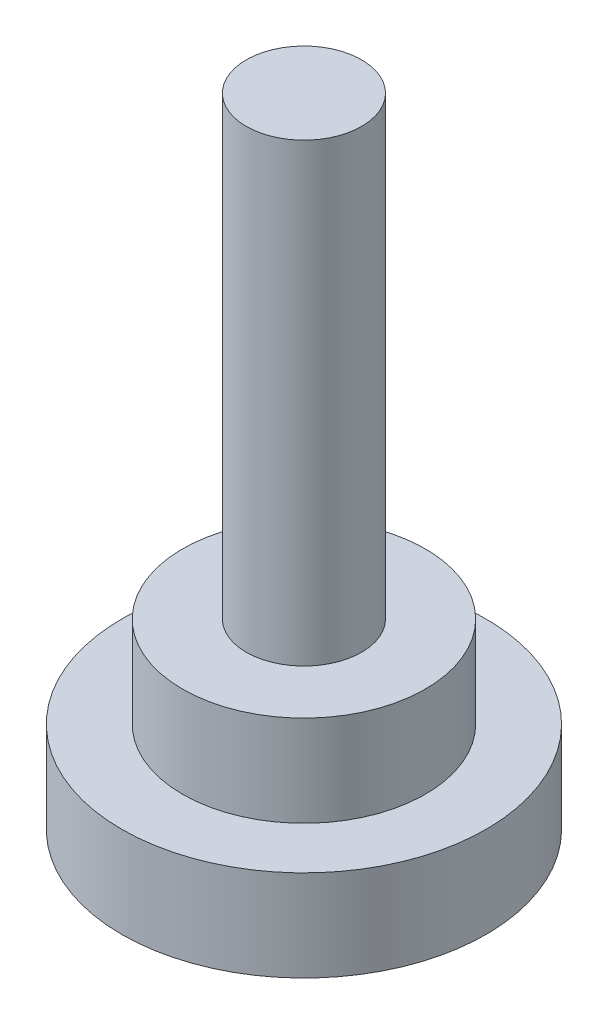
ISO-10303-21;
HEADER;
FILE_DESCRIPTION(('STEP AP214'),'2;1');
FILE_NAME('part.step','',(''),(''),'','','');
FILE_SCHEMA(('AUTOMOTIVE_DESIGN { 1 0 10303 214 1 1 1 1 }'));
ENDSEC;
DATA;
#1=APPLICATION_CONTEXT('core data for automotive mechanical design processes');
#2=APPLICATION_PROTOCOL_DEFINITION('international standard','automotive_design',2000,#1);
#3=PRODUCT_CONTEXT('',#1,'mechanical');
#4=PRODUCT('Part','Part','',(#3));
#5=PRODUCT_RELATED_PRODUCT_CATEGORY('part','',(#4));
#6=PRODUCT_DEFINITION_FORMATION('','',#4);
#7=PRODUCT_DEFINITION_CONTEXT('part definition',#1,'design');
#8=PRODUCT_DEFINITION('design','',#6,#7);
#9=PRODUCT_DEFINITION_SHAPE('','',#8);
#10=(LENGTH_UNIT() NAMED_UNIT(*) SI_UNIT(.MILLI.,.METRE.));
#11=(NAMED_UNIT(*) PLANE_ANGLE_UNIT() SI_UNIT($,.RADIAN.));
#12=(NAMED_UNIT(*) SI_UNIT($,.STERADIAN.) SOLID_ANGLE_UNIT());
#13=UNCERTAINTY_MEASURE_WITH_UNIT(LENGTH_MEASURE(1.E-05),#10,'distance_accuracy_value','');
#14=(GEOMETRIC_REPRESENTATION_CONTEXT(3) GLOBAL_UNCERTAINTY_ASSIGNED_CONTEXT((#13)) GLOBAL_UNIT_ASSIGNED_CONTEXT((#10,
#11,#12)) REPRESENTATION_CONTEXT('',''));
#15=CARTESIAN_POINT('',(0.,0.,0.));
#16=DIRECTION('',(0.,0.,1.));
#17=DIRECTION('',(1.,0.,0.));
#18=AXIS2_PLACEMENT_3D('',#15,#16,#17);
#19=CARTESIAN_POINT('',(0.,3.,0.));
#20=DIRECTION('',(0.,-1.,0.));
#21=DIRECTION('',(0.,0.,-1.));
#22=AXIS2_PLACEMENT_3D('',#19,#20,#21);
#23=CYLINDRICAL_SURFACE('',#22,6.);
#24=CARTESIAN_POINT('',(0.,3.,0.));
#25=DIRECTION('',(0.,1.,0.));
#26=DIRECTION('',(0.,0.,1.));
#27=AXIS2_PLACEMENT_3D('',#24,#25,#26);
#28=CIRCLE('',#27,6.);
#29=CARTESIAN_POINT('',(0.,3.,6.));
#30=VERTEX_POINT('',#29);
#31=EDGE_CURVE('E10',#30,#30,#28,.T.);
#32=ORIENTED_EDGE('',*,*,#31,.F.);
#33=EDGE_LOOP('',(#32));
#34=FACE_BOUND('',#33,.T.);
#35=CARTESIAN_POINT('',(0.,0.,0.));
#36=DIRECTION('',(0.,1.,0.));
#37=DIRECTION('',(0.,0.,1.));
#38=AXIS2_PLACEMENT_3D('',#35,#36,#37);
#39=CIRCLE('',#38,6.);
#40=CARTESIAN_POINT('',(0.,0.,6.));
#41=VERTEX_POINT('',#40);
#42=EDGE_CURVE('E40',#41,#41,#39,.T.);
#43=ORIENTED_EDGE('',*,*,#42,.T.);
#44=EDGE_LOOP('',(#43));
#45=FACE_BOUND('',#44,.T.);
#46=ADVANCED_FACE('F33',(#34,#45),#23,.T.);
#47=CARTESIAN_POINT('',(0.,3.,0.));
#48=DIRECTION('',(0.,1.,0.));
#49=DIRECTION('',(0.,0.,1.));
#50=AXIS2_PLACEMENT_3D('',#47,#48,#49);
#51=PLANE('',#50);
#52=CARTESIAN_POINT('',(0.,3.,0.));
#53=DIRECTION('',(0.,1.,0.));
#54=DIRECTION('',(0.,0.,1.));
#55=AXIS2_PLACEMENT_3D('',#52,#53,#54);
#56=CIRCLE('',#55,4.);
#57=CARTESIAN_POINT('',(0.,3.,4.));
#58=VERTEX_POINT('',#57);
#59=EDGE_CURVE('E49',#58,#58,#56,.T.);
#60=ORIENTED_EDGE('',*,*,#59,.F.);
#61=EDGE_LOOP('',(#60));
#62=FACE_BOUND('',#61,.T.);
#63=ORIENTED_EDGE('',*,*,#31,.T.);
#64=EDGE_LOOP('',(#63));
#65=FACE_BOUND('',#64,.T.);
#66=ADVANCED_FACE('F77',(#62,#65),#51,.T.);
#67=CARTESIAN_POINT('',(0.,0.,0.));
#68=DIRECTION('',(0.,1.,0.));
#69=DIRECTION('',(0.,0.,1.));
#70=AXIS2_PLACEMENT_3D('',#67,#68,#69);
#71=PLANE('',#70);
#72=ORIENTED_EDGE('',*,*,#42,.F.);
#73=EDGE_LOOP('',(#72));
#74=FACE_BOUND('',#73,.T.);
#75=ADVANCED_FACE('F73',(#74),#71,.F.);
#76=CARTESIAN_POINT('',(0.,6.,0.));
#77=DIRECTION('',(0.,-1.,0.));
#78=DIRECTION('',(0.,0.,-1.));
#79=AXIS2_PLACEMENT_3D('',#76,#77,#78);
#80=CYLINDRICAL_SURFACE('',#79,4.);
#81=CARTESIAN_POINT('',(0.,6.,0.));
#82=DIRECTION('',(0.,1.,0.));
#83=DIRECTION('',(0.,0.,1.));
#84=AXIS2_PLACEMENT_3D('',#81,#82,#83);
#85=CIRCLE('',#84,4.);
#86=CARTESIAN_POINT('',(0.,6.,4.));
#87=VERTEX_POINT('',#86);
#88=EDGE_CURVE('E52',#87,#87,#85,.T.);
#89=ORIENTED_EDGE('',*,*,#88,.F.);
#90=EDGE_LOOP('',(#89));
#91=FACE_BOUND('',#90,.T.);
#92=ORIENTED_EDGE('',*,*,#59,.T.);
#93=EDGE_LOOP('',(#92));
#94=FACE_BOUND('',#93,.T.);
#95=ADVANCED_FACE('F65',(#91,#94),#80,.T.);
#96=CARTESIAN_POINT('',(0.,6.,0.));
#97=DIRECTION('',(0.,1.,0.));
#98=DIRECTION('',(0.,0.,1.));
#99=AXIS2_PLACEMENT_3D('',#96,#97,#98);
#100=PLANE('',#99);
#101=CARTESIAN_POINT('',(0.,6.,0.));
#102=DIRECTION('',(0.,1.,0.));
#103=DIRECTION('',(0.,0.,1.));
#104=AXIS2_PLACEMENT_3D('',#101,#102,#103);
#105=CIRCLE('',#104,1.9);
#106=CARTESIAN_POINT('',(0.,6.,1.9));
#107=VERTEX_POINT('',#106);
#108=EDGE_CURVE('E36',#107,#107,#105,.T.);
#109=ORIENTED_EDGE('',*,*,#108,.F.);
#110=EDGE_LOOP('',(#109));
#111=FACE_BOUND('',#110,.T.);
#112=ORIENTED_EDGE('',*,*,#88,.T.);
#113=EDGE_LOOP('',(#112));
#114=FACE_BOUND('',#113,.T.);
#115=ADVANCED_FACE('F62',(#111,#114),#100,.T.);
#116=CARTESIAN_POINT('',(0.,21.,0.));
#117=DIRECTION('',(0.,1.,0.));
#118=DIRECTION('',(0.,0.,1.));
#119=AXIS2_PLACEMENT_3D('',#116,#117,#118);
#120=PLANE('',#119);
#121=CARTESIAN_POINT('',(0.,21.,0.));
#122=DIRECTION('',(0.,1.,0.));
#123=DIRECTION('',(0.,0.,1.));
#124=AXIS2_PLACEMENT_3D('',#121,#122,#123);
#125=CIRCLE('',#124,1.9);
#126=CARTESIAN_POINT('',(0.,21.,1.9));
#127=VERTEX_POINT('',#126);
#128=EDGE_CURVE('E45',#127,#127,#125,.T.);
#129=ORIENTED_EDGE('',*,*,#128,.T.);
#130=EDGE_LOOP('',(#129));
#131=FACE_BOUND('',#130,.T.);
#132=ADVANCED_FACE('F64',(#131),#120,.T.);
#133=CARTESIAN_POINT('',(0.,21.,0.));
#134=DIRECTION('',(0.,-1.,0.));
#135=DIRECTION('',(0.,0.,-1.));
#136=AXIS2_PLACEMENT_3D('',#133,#134,#135);
#137=CYLINDRICAL_SURFACE('',#136,1.9);
#138=ORIENTED_EDGE('',*,*,#108,.T.);
#139=EDGE_LOOP('',(#138));
#140=FACE_BOUND('',#139,.T.);
#141=ORIENTED_EDGE('',*,*,#128,.F.);
#142=EDGE_LOOP('',(#141));
#143=FACE_BOUND('',#142,.T.);
#144=ADVANCED_FACE('F59',(#140,#143),#137,.T.);
#145=CLOSED_SHELL('',(#46,#66,#75,#95,#115,#132,#144));
#146=MANIFOLD_SOLID_BREP('B2',#145);
#147=ADVANCED_BREP_SHAPE_REPRESENTATION('',(#18,#146),#14);
#148=SHAPE_DEFINITION_REPRESENTATION(#9,#147);
ENDSEC;
END-ISO-10303-21;
